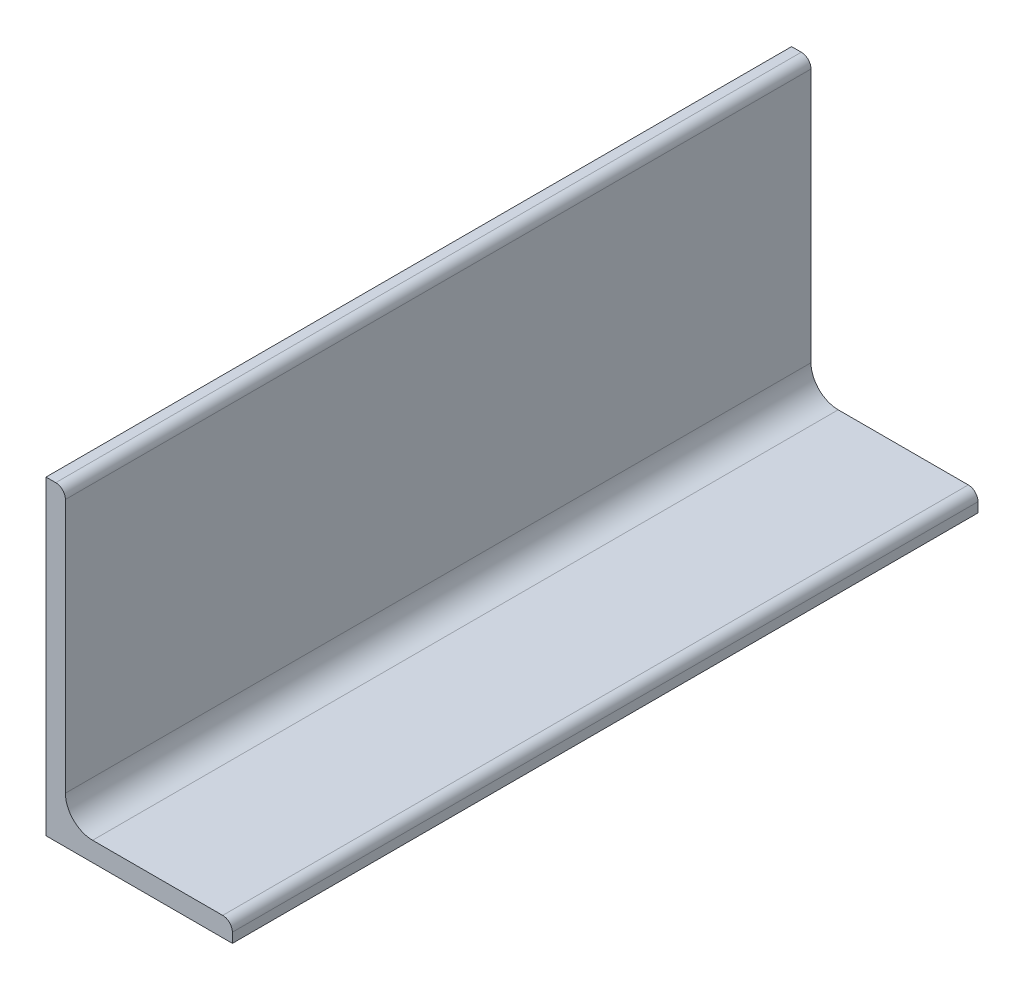
ISO-10303-21;
HEADER;
FILE_DESCRIPTION(('STEP AP214'),'2;1');
FILE_NAME('part.step','',(''),(''),'','','');
FILE_SCHEMA(('AUTOMOTIVE_DESIGN { 1 0 10303 214 1 1 1 1 }'));
ENDSEC;
DATA;
#1=APPLICATION_CONTEXT('core data for automotive mechanical design processes');
#2=APPLICATION_PROTOCOL_DEFINITION('international standard','automotive_design',2000,#1);
#3=PRODUCT_CONTEXT('',#1,'mechanical');
#4=PRODUCT('Part','Part','',(#3));
#5=PRODUCT_RELATED_PRODUCT_CATEGORY('part','',(#4));
#6=PRODUCT_DEFINITION_FORMATION('','',#4);
#7=PRODUCT_DEFINITION_CONTEXT('part definition',#1,'design');
#8=PRODUCT_DEFINITION('design','',#6,#7);
#9=PRODUCT_DEFINITION_SHAPE('','',#8);
#10=(LENGTH_UNIT() NAMED_UNIT(*) SI_UNIT(.MILLI.,.METRE.));
#11=(NAMED_UNIT(*) PLANE_ANGLE_UNIT() SI_UNIT($,.RADIAN.));
#12=(NAMED_UNIT(*) SI_UNIT($,.STERADIAN.) SOLID_ANGLE_UNIT());
#13=UNCERTAINTY_MEASURE_WITH_UNIT(LENGTH_MEASURE(1.E-05),#10,'distance_accuracy_value','');
#14=(GEOMETRIC_REPRESENTATION_CONTEXT(3) GLOBAL_UNCERTAINTY_ASSIGNED_CONTEXT((#13)) GLOBAL_UNIT_ASSIGNED_CONTEXT((#10,
#11,#12)) REPRESENTATION_CONTEXT('',''));
#15=CARTESIAN_POINT('',(0.,0.,0.));
#16=DIRECTION('',(0.,0.,1.));
#17=DIRECTION('',(1.,0.,0.));
#18=AXIS2_PLACEMENT_3D('',#15,#16,#17);
#19=CARTESIAN_POINT('',(0.490776827053332,127.041655270204,304.8));
#20=DIRECTION('',(1.,0.,0.));
#21=DIRECTION('',(0.,0.,-1.));
#22=AXIS2_PLACEMENT_3D('',#19,#20,#21);
#23=PLANE('',#22);
#24=DIRECTION('',(0.,-1.,0.));
#25=VECTOR('',#24,1.);
#26=CARTESIAN_POINT('',(0.490776827053332,127.041655270204,0.));
#27=LINE('',#26,#25);
#28=CARTESIAN_POINT('',(0.490776827053332,127.041655270204,0.));
#29=VERTEX_POINT('',#28);
#30=CARTESIAN_POINT('',(0.490776827053332,0.0416552702040917,0.));
#31=VERTEX_POINT('',#30);
#32=EDGE_CURVE('E135',#29,#31,#27,.T.);
#33=ORIENTED_EDGE('',*,*,#32,.T.);
#34=DIRECTION('',(0.,0.,-1.));
#35=VECTOR('',#34,1.);
#36=CARTESIAN_POINT('',(0.490776827053332,0.0416552702040917,304.8));
#37=LINE('',#36,#35);
#38=CARTESIAN_POINT('',(0.490776827053332,0.0416552702040917,304.8));
#39=VERTEX_POINT('',#38);
#40=EDGE_CURVE('E11',#39,#31,#37,.T.);
#41=ORIENTED_EDGE('',*,*,#40,.F.);
#42=DIRECTION('',(0.,-1.,0.));
#43=VECTOR('',#42,1.);
#44=CARTESIAN_POINT('',(0.490776827053332,127.041655270204,304.8));
#45=LINE('',#44,#43);
#46=CARTESIAN_POINT('',(0.490776827053332,127.041655270204,304.8));
#47=VERTEX_POINT('',#46);
#48=EDGE_CURVE('E151',#47,#39,#45,.T.);
#49=ORIENTED_EDGE('',*,*,#48,.F.);
#50=DIRECTION('',(0.,0.,-1.));
#51=VECTOR('',#50,1.);
#52=CARTESIAN_POINT('',(0.490776827053332,127.041655270204,304.8));
#53=LINE('',#52,#51);
#54=EDGE_CURVE('E131',#47,#29,#53,.T.);
#55=ORIENTED_EDGE('',*,*,#54,.T.);
#56=EDGE_LOOP('',(#33,#41,#49,#55));
#57=FACE_BOUND('',#56,.T.);
#58=ADVANCED_FACE('F33',(#57),#23,.F.);
#59=CARTESIAN_POINT('',(0.490776827053332,0.0416552702040917,304.8));
#60=DIRECTION('',(0.,1.,0.));
#61=DIRECTION('',(0.,0.,1.));
#62=AXIS2_PLACEMENT_3D('',#59,#60,#61);
#63=PLANE('',#62);
#64=DIRECTION('',(1.,0.,0.));
#65=VECTOR('',#64,1.);
#66=CARTESIAN_POINT('',(0.490776827053332,0.0416552702040917,0.));
#67=LINE('',#66,#65);
#68=CARTESIAN_POINT('',(76.6907768270533,0.0416552702040917,0.));
#69=VERTEX_POINT('',#68);
#70=EDGE_CURVE('E138',#31,#69,#67,.T.);
#71=ORIENTED_EDGE('',*,*,#70,.T.);
#72=DIRECTION('',(0.,0.,-1.));
#73=VECTOR('',#72,1.);
#74=CARTESIAN_POINT('',(76.6907768270533,0.0416552702040917,304.8));
#75=LINE('',#74,#73);
#76=CARTESIAN_POINT('',(76.6907768270533,0.0416552702040917,304.8));
#77=VERTEX_POINT('',#76);
#78=EDGE_CURVE('E41',#77,#69,#75,.T.);
#79=ORIENTED_EDGE('',*,*,#78,.F.);
#80=DIRECTION('',(1.,0.,0.));
#81=VECTOR('',#80,1.);
#82=CARTESIAN_POINT('',(0.490776827053332,0.0416552702040917,304.8));
#83=LINE('',#82,#81);
#84=EDGE_CURVE('E95',#39,#77,#83,.T.);
#85=ORIENTED_EDGE('',*,*,#84,.F.);
#86=ORIENTED_EDGE('',*,*,#40,.T.);
#87=EDGE_LOOP('',(#71,#79,#85,#86));
#88=FACE_BOUND('',#87,.T.);
#89=ADVANCED_FACE('F194',(#88),#63,.F.);
#90=CARTESIAN_POINT('',(76.6907768270533,0.0416552702040917,304.8));
#91=DIRECTION('',(-1.,0.,0.));
#92=DIRECTION('',(0.,0.,1.));
#93=AXIS2_PLACEMENT_3D('',#90,#91,#92);
#94=PLANE('',#93);
#95=DIRECTION('',(0.,1.,0.));
#96=VECTOR('',#95,1.);
#97=CARTESIAN_POINT('',(76.6907768270533,0.0416552702040917,0.));
#98=LINE('',#97,#96);
#99=CARTESIAN_POINT('',(76.6907768270533,4.01040527020409,0.));
#100=VERTEX_POINT('',#99);
#101=EDGE_CURVE('E140',#69,#100,#98,.T.);
#102=ORIENTED_EDGE('',*,*,#101,.T.);
#103=DIRECTION('',(0.,0.,-1.));
#104=VECTOR('',#103,1.);
#105=CARTESIAN_POINT('',(76.6907768270533,4.01040527020409,304.8));
#106=LINE('',#105,#104);
#107=CARTESIAN_POINT('',(76.6907768270533,4.01040527020409,304.8));
#108=VERTEX_POINT('',#107);
#109=EDGE_CURVE('E161',#108,#100,#106,.T.);
#110=ORIENTED_EDGE('',*,*,#109,.F.);
#111=DIRECTION('',(0.,1.,0.));
#112=VECTOR('',#111,1.);
#113=CARTESIAN_POINT('',(76.6907768270533,0.0416552702040917,304.8));
#114=LINE('',#113,#112);
#115=EDGE_CURVE('E169',#77,#108,#114,.T.);
#116=ORIENTED_EDGE('',*,*,#115,.F.);
#117=ORIENTED_EDGE('',*,*,#78,.T.);
#118=EDGE_LOOP('',(#102,#110,#116,#117));
#119=FACE_BOUND('',#118,.T.);
#120=ADVANCED_FACE('F167',(#119),#94,.F.);
#121=CARTESIAN_POINT('',(72.7220268270533,4.01040527020409,304.8));
#122=DIRECTION('',(0.,0.,-1.));
#123=DIRECTION('',(-1.,0.,0.));
#124=AXIS2_PLACEMENT_3D('',#121,#122,#123);
#125=CYLINDRICAL_SURFACE('',#124,3.96875);
#126=CARTESIAN_POINT('',(72.7220268270533,4.01040527020409,0.));
#127=DIRECTION('',(0.,0.,1.));
#128=DIRECTION('',(1.,0.,0.));
#129=AXIS2_PLACEMENT_3D('',#126,#127,#128);
#130=CIRCLE('',#129,3.96875);
#131=CARTESIAN_POINT('',(72.7220268270533,7.97915527020409,0.));
#132=VERTEX_POINT('',#131);
#133=EDGE_CURVE('E142',#100,#132,#130,.T.);
#134=ORIENTED_EDGE('',*,*,#133,.T.);
#135=DIRECTION('',(0.,0.,-1.));
#136=VECTOR('',#135,1.);
#137=CARTESIAN_POINT('',(72.7220268270533,7.97915527020409,304.8));
#138=LINE('',#137,#136);
#139=CARTESIAN_POINT('',(72.7220268270533,7.97915527020409,304.8));
#140=VERTEX_POINT('',#139);
#141=EDGE_CURVE('E158',#140,#132,#138,.T.);
#142=ORIENTED_EDGE('',*,*,#141,.F.);
#143=CARTESIAN_POINT('',(72.7220268270533,4.01040527020409,304.8));
#144=DIRECTION('',(0.,0.,1.));
#145=DIRECTION('',(1.,0.,0.));
#146=AXIS2_PLACEMENT_3D('',#143,#144,#145);
#147=CIRCLE('',#146,3.96875);
#148=EDGE_CURVE('E185',#108,#140,#147,.T.);
#149=ORIENTED_EDGE('',*,*,#148,.F.);
#150=ORIENTED_EDGE('',*,*,#109,.T.);
#151=EDGE_LOOP('',(#134,#142,#149,#150));
#152=FACE_BOUND('',#151,.T.);
#153=ADVANCED_FACE('F178',(#152),#125,.T.);
#154=CARTESIAN_POINT('',(72.7220268270533,7.97915527020409,304.8));
#155=DIRECTION('',(0.,-1.,0.));
#156=DIRECTION('',(0.,0.,-1.));
#157=AXIS2_PLACEMENT_3D('',#154,#155,#156);
#158=PLANE('',#157);
#159=DIRECTION('',(-1.,0.,0.));
#160=VECTOR('',#159,1.);
#161=CARTESIAN_POINT('',(72.7220268270533,7.97915527020409,0.));
#162=LINE('',#161,#160);
#163=CARTESIAN_POINT('',(19.5407768270533,7.97915527020409,0.));
#164=VERTEX_POINT('',#163);
#165=EDGE_CURVE('E144',#132,#164,#162,.T.);
#166=ORIENTED_EDGE('',*,*,#165,.T.);
#167=DIRECTION('',(0.,0.,-1.));
#168=VECTOR('',#167,1.);
#169=CARTESIAN_POINT('',(19.5407768270533,7.97915527020409,304.8));
#170=LINE('',#169,#168);
#171=CARTESIAN_POINT('',(19.5407768270533,7.97915527020409,304.8));
#172=VERTEX_POINT('',#171);
#173=EDGE_CURVE('E155',#172,#164,#170,.T.);
#174=ORIENTED_EDGE('',*,*,#173,.F.);
#175=DIRECTION('',(-1.,0.,0.));
#176=VECTOR('',#175,1.);
#177=CARTESIAN_POINT('',(72.7220268270533,7.97915527020409,304.8));
#178=LINE('',#177,#176);
#179=EDGE_CURVE('E184',#140,#172,#178,.T.);
#180=ORIENTED_EDGE('',*,*,#179,.F.);
#181=ORIENTED_EDGE('',*,*,#141,.T.);
#182=EDGE_LOOP('',(#166,#174,#180,#181));
#183=FACE_BOUND('',#182,.T.);
#184=ADVANCED_FACE('F182',(#183),#158,.F.);
#185=CARTESIAN_POINT('',(19.5407768270533,19.0916552702041,304.8));
#186=DIRECTION('',(0.,0.,-1.));
#187=DIRECTION('',(-1.,0.,0.));
#188=AXIS2_PLACEMENT_3D('',#185,#186,#187);
#189=CYLINDRICAL_SURFACE('',#188,11.1125);
#190=CARTESIAN_POINT('',(19.5407768270533,19.0916552702041,0.));
#191=DIRECTION('',(0.,0.,-1.));
#192=DIRECTION('',(1.,0.,0.));
#193=AXIS2_PLACEMENT_3D('',#190,#191,#192);
#194=CIRCLE('',#193,11.1125);
#195=CARTESIAN_POINT('',(8.42827682705333,19.0916552702041,0.));
#196=VERTEX_POINT('',#195);
#197=EDGE_CURVE('E146',#164,#196,#194,.T.);
#198=ORIENTED_EDGE('',*,*,#197,.T.);
#199=DIRECTION('',(0.,0.,-1.));
#200=VECTOR('',#199,1.);
#201=CARTESIAN_POINT('',(8.42827682705333,19.0916552702041,304.8));
#202=LINE('',#201,#200);
#203=CARTESIAN_POINT('',(8.42827682705333,19.0916552702041,304.8));
#204=VERTEX_POINT('',#203);
#205=EDGE_CURVE('E126',#204,#196,#202,.T.);
#206=ORIENTED_EDGE('',*,*,#205,.F.);
#207=CARTESIAN_POINT('',(19.5407768270533,19.0916552702041,304.8));
#208=DIRECTION('',(0.,0.,-1.));
#209=DIRECTION('',(1.,0.,0.));
#210=AXIS2_PLACEMENT_3D('',#207,#208,#209);
#211=CIRCLE('',#210,11.1125);
#212=EDGE_CURVE('E117',#172,#204,#211,.T.);
#213=ORIENTED_EDGE('',*,*,#212,.F.);
#214=ORIENTED_EDGE('',*,*,#173,.T.);
#215=EDGE_LOOP('',(#198,#206,#213,#214));
#216=FACE_BOUND('',#215,.T.);
#217=ADVANCED_FACE('F206',(#216),#189,.F.);
#218=CARTESIAN_POINT('',(8.42827682705333,19.0916552702041,304.8));
#219=DIRECTION('',(-1.,0.,0.));
#220=DIRECTION('',(0.,0.,1.));
#221=AXIS2_PLACEMENT_3D('',#218,#219,#220);
#222=PLANE('',#221);
#223=DIRECTION('',(0.,1.,0.));
#224=VECTOR('',#223,1.);
#225=CARTESIAN_POINT('',(8.42827682705333,19.0916552702041,0.));
#226=LINE('',#225,#224);
#227=CARTESIAN_POINT('',(8.42827682705333,123.072905270204,0.));
#228=VERTEX_POINT('',#227);
#229=EDGE_CURVE('E125',#196,#228,#226,.T.);
#230=ORIENTED_EDGE('',*,*,#229,.T.);
#231=DIRECTION('',(0.,0.,-1.));
#232=VECTOR('',#231,1.);
#233=CARTESIAN_POINT('',(8.42827682705333,123.072905270204,304.8));
#234=LINE('',#233,#232);
#235=CARTESIAN_POINT('',(8.42827682705333,123.072905270204,304.8));
#236=VERTEX_POINT('',#235);
#237=EDGE_CURVE('E122',#236,#228,#234,.T.);
#238=ORIENTED_EDGE('',*,*,#237,.F.);
#239=DIRECTION('',(0.,1.,0.));
#240=VECTOR('',#239,1.);
#241=CARTESIAN_POINT('',(8.42827682705333,19.0916552702041,304.8));
#242=LINE('',#241,#240);
#243=EDGE_CURVE('E111',#204,#236,#242,.T.);
#244=ORIENTED_EDGE('',*,*,#243,.F.);
#245=ORIENTED_EDGE('',*,*,#205,.T.);
#246=EDGE_LOOP('',(#230,#238,#244,#245));
#247=FACE_BOUND('',#246,.T.);
#248=ADVANCED_FACE('F123',(#247),#222,.F.);
#249=CARTESIAN_POINT('',(4.45952682705334,123.072905270204,304.8));
#250=DIRECTION('',(0.,0.,-1.));
#251=DIRECTION('',(-1.,0.,0.));
#252=AXIS2_PLACEMENT_3D('',#249,#250,#251);
#253=CYLINDRICAL_SURFACE('',#252,3.96875);
#254=CARTESIAN_POINT('',(4.45952682705334,123.072905270204,0.));
#255=DIRECTION('',(0.,0.,1.));
#256=DIRECTION('',(1.,0.,0.));
#257=AXIS2_PLACEMENT_3D('',#254,#255,#256);
#258=CIRCLE('',#257,3.96875);
#259=CARTESIAN_POINT('',(4.45952682705333,127.041655270204,0.));
#260=VERTEX_POINT('',#259);
#261=EDGE_CURVE('E81',#228,#260,#258,.T.);
#262=ORIENTED_EDGE('',*,*,#261,.T.);
#263=DIRECTION('',(0.,0.,-1.));
#264=VECTOR('',#263,1.);
#265=CARTESIAN_POINT('',(4.45952682705333,127.041655270204,304.8));
#266=LINE('',#265,#264);
#267=CARTESIAN_POINT('',(4.45952682705333,127.041655270204,304.8));
#268=VERTEX_POINT('',#267);
#269=EDGE_CURVE('E127',#268,#260,#266,.T.);
#270=ORIENTED_EDGE('',*,*,#269,.F.);
#271=CARTESIAN_POINT('',(4.45952682705334,123.072905270204,304.8));
#272=DIRECTION('',(0.,0.,1.));
#273=DIRECTION('',(1.,0.,0.));
#274=AXIS2_PLACEMENT_3D('',#271,#272,#273);
#275=CIRCLE('',#274,3.96875);
#276=EDGE_CURVE('E115',#236,#268,#275,.T.);
#277=ORIENTED_EDGE('',*,*,#276,.F.);
#278=ORIENTED_EDGE('',*,*,#237,.T.);
#279=EDGE_LOOP('',(#262,#270,#277,#278));
#280=FACE_BOUND('',#279,.T.);
#281=ADVANCED_FACE('F129',(#280),#253,.T.);
#282=CARTESIAN_POINT('',(4.45952682705333,127.041655270204,304.8));
#283=DIRECTION('',(0.,-1.,0.));
#284=DIRECTION('',(0.,0.,-1.));
#285=AXIS2_PLACEMENT_3D('',#282,#283,#284);
#286=PLANE('',#285);
#287=DIRECTION('',(-1.,0.,0.));
#288=VECTOR('',#287,1.);
#289=CARTESIAN_POINT('',(4.45952682705333,127.041655270204,0.));
#290=LINE('',#289,#288);
#291=EDGE_CURVE('E87',#260,#29,#290,.T.);
#292=ORIENTED_EDGE('',*,*,#291,.T.);
#293=ORIENTED_EDGE('',*,*,#54,.F.);
#294=DIRECTION('',(-1.,0.,0.));
#295=VECTOR('',#294,1.);
#296=CARTESIAN_POINT('',(4.45952682705333,127.041655270204,304.8));
#297=LINE('',#296,#295);
#298=EDGE_CURVE('E49',#268,#47,#297,.T.);
#299=ORIENTED_EDGE('',*,*,#298,.F.);
#300=ORIENTED_EDGE('',*,*,#269,.T.);
#301=EDGE_LOOP('',(#292,#293,#299,#300));
#302=FACE_BOUND('',#301,.T.);
#303=ADVANCED_FACE('F214',(#302),#286,.F.);
#304=CARTESIAN_POINT('',(72.7220268270533,4.01040527020409,304.8));
#305=DIRECTION('',(0.,0.,1.));
#306=DIRECTION('',(1.,0.,0.));
#307=AXIS2_PLACEMENT_3D('',#304,#305,#306);
#308=PLANE('',#307);
#309=ORIENTED_EDGE('',*,*,#48,.T.);
#310=ORIENTED_EDGE('',*,*,#84,.T.);
#311=ORIENTED_EDGE('',*,*,#115,.T.);
#312=ORIENTED_EDGE('',*,*,#148,.T.);
#313=ORIENTED_EDGE('',*,*,#179,.T.);
#314=ORIENTED_EDGE('',*,*,#212,.T.);
#315=ORIENTED_EDGE('',*,*,#243,.T.);
#316=ORIENTED_EDGE('',*,*,#276,.T.);
#317=ORIENTED_EDGE('',*,*,#298,.T.);
#318=EDGE_LOOP('',(#309,#310,#311,#312,#313,#314,#315,#316,#317));
#319=FACE_BOUND('',#318,.T.);
#320=ADVANCED_FACE('F113',(#319),#308,.T.);
#321=CARTESIAN_POINT('',(72.7220268270533,4.01040527020409,0.));
#322=DIRECTION('',(0.,0.,1.));
#323=DIRECTION('',(1.,0.,0.));
#324=AXIS2_PLACEMENT_3D('',#321,#322,#323);
#325=PLANE('',#324);
#326=ORIENTED_EDGE('',*,*,#32,.F.);
#327=ORIENTED_EDGE('',*,*,#291,.F.);
#328=ORIENTED_EDGE('',*,*,#261,.F.);
#329=ORIENTED_EDGE('',*,*,#229,.F.);
#330=ORIENTED_EDGE('',*,*,#197,.F.);
#331=ORIENTED_EDGE('',*,*,#165,.F.);
#332=ORIENTED_EDGE('',*,*,#133,.F.);
#333=ORIENTED_EDGE('',*,*,#101,.F.);
#334=ORIENTED_EDGE('',*,*,#70,.F.);
#335=EDGE_LOOP('',(#326,#327,#328,#329,#330,#331,#332,#333,#334));
#336=FACE_BOUND('',#335,.T.);
#337=ADVANCED_FACE('F173',(#336),#325,.F.);
#338=CLOSED_SHELL('',(#58,#89,#120,#153,#184,#217,#248,#281,#303,#320,#337));
#339=MANIFOLD_SOLID_BREP('B2',#338);
#340=ADVANCED_BREP_SHAPE_REPRESENTATION('',(#18,#339),#14);
#341=SHAPE_DEFINITION_REPRESENTATION(#9,#340);
ENDSEC;
END-ISO-10303-21;
